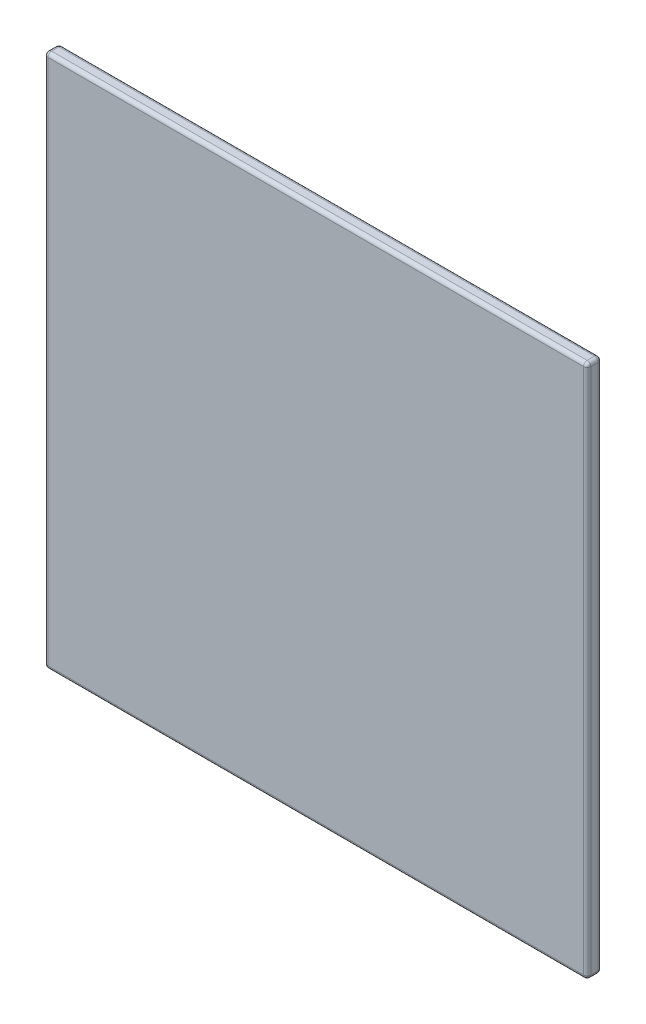
ISO-10303-21;
HEADER;
FILE_DESCRIPTION(('STEP AP214'),'2;1');
FILE_NAME('part.step','',(''),(''),'','','');
FILE_SCHEMA(('AUTOMOTIVE_DESIGN { 1 0 10303 214 1 1 1 1 }'));
ENDSEC;
DATA;
#1=APPLICATION_CONTEXT('core data for automotive mechanical design processes');
#2=APPLICATION_PROTOCOL_DEFINITION('international standard','automotive_design',2000,#1);
#3=PRODUCT_CONTEXT('',#1,'mechanical');
#4=PRODUCT('Part','Part','',(#3));
#5=PRODUCT_RELATED_PRODUCT_CATEGORY('part','',(#4));
#6=PRODUCT_DEFINITION_FORMATION('','',#4);
#7=PRODUCT_DEFINITION_CONTEXT('part definition',#1,'design');
#8=PRODUCT_DEFINITION('design','',#6,#7);
#9=PRODUCT_DEFINITION_SHAPE('','',#8);
#10=(LENGTH_UNIT() NAMED_UNIT(*) SI_UNIT(.MILLI.,.METRE.));
#11=(NAMED_UNIT(*) PLANE_ANGLE_UNIT() SI_UNIT($,.RADIAN.));
#12=(NAMED_UNIT(*) SI_UNIT($,.STERADIAN.) SOLID_ANGLE_UNIT());
#13=UNCERTAINTY_MEASURE_WITH_UNIT(LENGTH_MEASURE(1.E-05),#10,'distance_accuracy_value','');
#14=(GEOMETRIC_REPRESENTATION_CONTEXT(3) GLOBAL_UNCERTAINTY_ASSIGNED_CONTEXT((#13)) GLOBAL_UNIT_ASSIGNED_CONTEXT((#10,
#11,#12)) REPRESENTATION_CONTEXT('',''));
#15=CARTESIAN_POINT('',(0.,0.,0.));
#16=DIRECTION('',(0.,0.,1.));
#17=DIRECTION('',(1.,0.,0.));
#18=AXIS2_PLACEMENT_3D('',#15,#16,#17);
#19=CARTESIAN_POINT('',(37.35,-36.75,2.));
#20=DIRECTION('',(-1.,0.,0.));
#21=DIRECTION('',(0.,0.,1.));
#22=AXIS2_PLACEMENT_3D('',#19,#20,#21);
#23=PLANE('',#22);
#24=DIRECTION('',(0.,1.,0.));
#25=VECTOR('',#24,1.);
#26=CARTESIAN_POINT('',(37.35,-36.75,1.5));
#27=LINE('',#26,#25);
#28=CARTESIAN_POINT('',(37.35,36.25,1.5));
#29=VERTEX_POINT('',#28);
#30=CARTESIAN_POINT('',(37.35,-36.25,1.5));
#31=VERTEX_POINT('',#30);
#32=EDGE_CURVE('E42',#29,#31,#27,.F.);
#33=ORIENTED_EDGE('',*,*,#32,.T.);
#34=DIRECTION('',(0.,0.,-1.));
#35=VECTOR('',#34,1.);
#36=CARTESIAN_POINT('',(37.35,-36.25,2.));
#37=LINE('',#36,#35);
#38=CARTESIAN_POINT('',(37.35,-36.25,0.5));
#39=VERTEX_POINT('',#38);
#40=EDGE_CURVE('E11',#31,#39,#37,.T.);
#41=ORIENTED_EDGE('',*,*,#40,.T.);
#42=DIRECTION('',(0.,1.,0.));
#43=VECTOR('',#42,1.);
#44=CARTESIAN_POINT('',(37.35,36.75,0.5));
#45=LINE('',#44,#43);
#46=CARTESIAN_POINT('',(37.35,36.25,0.5));
#47=VERTEX_POINT('',#46);
#48=EDGE_CURVE('E194',#39,#47,#45,.T.);
#49=ORIENTED_EDGE('',*,*,#48,.T.);
#50=DIRECTION('',(0.,0.,-1.));
#51=VECTOR('',#50,1.);
#52=CARTESIAN_POINT('',(37.35,36.25,2.));
#53=LINE('',#52,#51);
#54=EDGE_CURVE('E53',#47,#29,#53,.F.);
#55=ORIENTED_EDGE('',*,*,#54,.T.);
#56=EDGE_LOOP('',(#33,#41,#49,#55));
#57=FACE_BOUND('',#56,.T.);
#58=ADVANCED_FACE('F33',(#57),#23,.F.);
#59=CARTESIAN_POINT('',(-37.35,36.75,2.));
#60=DIRECTION('',(0.,-1.,0.));
#61=DIRECTION('',(0.,0.,-1.));
#62=AXIS2_PLACEMENT_3D('',#59,#60,#61);
#63=PLANE('',#62);
#64=DIRECTION('',(0.,0.,-1.));
#65=VECTOR('',#64,1.);
#66=CARTESIAN_POINT('',(-36.85,36.75,2.));
#67=LINE('',#66,#65);
#68=CARTESIAN_POINT('',(-36.85,36.75,0.5));
#69=VERTEX_POINT('',#68);
#70=CARTESIAN_POINT('',(-36.85,36.75,1.5));
#71=VERTEX_POINT('',#70);
#72=EDGE_CURVE('E189',#69,#71,#67,.F.);
#73=ORIENTED_EDGE('',*,*,#72,.T.);
#74=DIRECTION('',(-1.,0.,0.));
#75=VECTOR('',#74,1.);
#76=CARTESIAN_POINT('',(-37.35,36.75,1.5));
#77=LINE('',#76,#75);
#78=CARTESIAN_POINT('',(36.85,36.75,1.5));
#79=VERTEX_POINT('',#78);
#80=EDGE_CURVE('E191',#71,#79,#77,.F.);
#81=ORIENTED_EDGE('',*,*,#80,.T.);
#82=DIRECTION('',(0.,0.,-1.));
#83=VECTOR('',#82,1.);
#84=CARTESIAN_POINT('',(36.85,36.75,2.));
#85=LINE('',#84,#83);
#86=CARTESIAN_POINT('',(36.85,36.75,0.5));
#87=VERTEX_POINT('',#86);
#88=EDGE_CURVE('E185',#79,#87,#85,.T.);
#89=ORIENTED_EDGE('',*,*,#88,.T.);
#90=DIRECTION('',(-1.,0.,0.));
#91=VECTOR('',#90,1.);
#92=CARTESIAN_POINT('',(-37.35,36.75,0.5));
#93=LINE('',#92,#91);
#94=EDGE_CURVE('E187',#87,#69,#93,.T.);
#95=ORIENTED_EDGE('',*,*,#94,.T.);
#96=EDGE_LOOP('',(#73,#81,#89,#95));
#97=FACE_BOUND('',#96,.T.);
#98=ADVANCED_FACE('F278',(#97),#63,.F.);
#99=CARTESIAN_POINT('',(-37.35,-36.75,2.));
#100=DIRECTION('',(1.,0.,0.));
#101=DIRECTION('',(0.,0.,-1.));
#102=AXIS2_PLACEMENT_3D('',#99,#100,#101);
#103=PLANE('',#102);
#104=DIRECTION('',(0.,0.,-1.));
#105=VECTOR('',#104,1.);
#106=CARTESIAN_POINT('',(-37.35,-36.25,2.));
#107=LINE('',#106,#105);
#108=CARTESIAN_POINT('',(-37.35,-36.25,0.5));
#109=VERTEX_POINT('',#108);
#110=CARTESIAN_POINT('',(-37.35,-36.25,1.5));
#111=VERTEX_POINT('',#110);
#112=EDGE_CURVE('E180',#109,#111,#107,.F.);
#113=ORIENTED_EDGE('',*,*,#112,.T.);
#114=DIRECTION('',(0.,-1.,0.));
#115=VECTOR('',#114,1.);
#116=CARTESIAN_POINT('',(-37.35,-36.75,1.5));
#117=LINE('',#116,#115);
#118=CARTESIAN_POINT('',(-37.35,36.25,1.5));
#119=VERTEX_POINT('',#118);
#120=EDGE_CURVE('E182',#111,#119,#117,.F.);
#121=ORIENTED_EDGE('',*,*,#120,.T.);
#122=DIRECTION('',(0.,0.,-1.));
#123=VECTOR('',#122,1.);
#124=CARTESIAN_POINT('',(-37.35,36.25,2.));
#125=LINE('',#124,#123);
#126=CARTESIAN_POINT('',(-37.35,36.25,0.5));
#127=VERTEX_POINT('',#126);
#128=EDGE_CURVE('E176',#119,#127,#125,.T.);
#129=ORIENTED_EDGE('',*,*,#128,.T.);
#130=DIRECTION('',(0.,-1.,0.));
#131=VECTOR('',#130,1.);
#132=CARTESIAN_POINT('',(-37.35,-36.75,0.5));
#133=LINE('',#132,#131);
#134=EDGE_CURVE('E178',#127,#109,#133,.T.);
#135=ORIENTED_EDGE('',*,*,#134,.T.);
#136=EDGE_LOOP('',(#113,#121,#129,#135));
#137=FACE_BOUND('',#136,.T.);
#138=ADVANCED_FACE('F269',(#137),#103,.F.);
#139=CARTESIAN_POINT('',(-37.35,-36.75,2.));
#140=DIRECTION('',(0.,1.,0.));
#141=DIRECTION('',(0.,0.,1.));
#142=AXIS2_PLACEMENT_3D('',#139,#140,#141);
#143=PLANE('',#142);
#144=DIRECTION('',(1.,0.,0.));
#145=VECTOR('',#144,1.);
#146=CARTESIAN_POINT('',(-37.35,-36.75,1.5));
#147=LINE('',#146,#145);
#148=CARTESIAN_POINT('',(36.85,-36.75,1.5));
#149=VERTEX_POINT('',#148);
#150=CARTESIAN_POINT('',(-36.85,-36.75,1.5));
#151=VERTEX_POINT('',#150);
#152=EDGE_CURVE('E129',#149,#151,#147,.F.);
#153=ORIENTED_EDGE('',*,*,#152,.T.);
#154=DIRECTION('',(0.,0.,-1.));
#155=VECTOR('',#154,1.);
#156=CARTESIAN_POINT('',(-36.85,-36.75,2.));
#157=LINE('',#156,#155);
#158=CARTESIAN_POINT('',(-36.85,-36.75,0.5));
#159=VERTEX_POINT('',#158);
#160=EDGE_CURVE('E165',#151,#159,#157,.T.);
#161=ORIENTED_EDGE('',*,*,#160,.T.);
#162=DIRECTION('',(1.,0.,0.));
#163=VECTOR('',#162,1.);
#164=CARTESIAN_POINT('',(37.35,-36.75,0.5));
#165=LINE('',#164,#163);
#166=CARTESIAN_POINT('',(36.85,-36.75,0.5));
#167=VERTEX_POINT('',#166);
#168=EDGE_CURVE('E158',#159,#167,#165,.T.);
#169=ORIENTED_EDGE('',*,*,#168,.T.);
#170=DIRECTION('',(0.,0.,-1.));
#171=VECTOR('',#170,1.);
#172=CARTESIAN_POINT('',(36.85,-36.75,2.));
#173=LINE('',#172,#171);
#174=EDGE_CURVE('E156',#167,#149,#173,.F.);
#175=ORIENTED_EDGE('',*,*,#174,.T.);
#176=EDGE_LOOP('',(#153,#161,#169,#175));
#177=FACE_BOUND('',#176,.T.);
#178=ADVANCED_FACE('F356',(#177),#143,.F.);
#179=CARTESIAN_POINT('',(0.,0.,2.));
#180=DIRECTION('',(0.,0.,-1.));
#181=DIRECTION('',(-1.,0.,0.));
#182=AXIS2_PLACEMENT_3D('',#179,#180,#181);
#183=PLANE('',#182);
#184=DIRECTION('',(0.,-1.,0.));
#185=VECTOR('',#184,1.);
#186=CARTESIAN_POINT('',(-36.85,0.,2.));
#187=LINE('',#186,#185);
#188=CARTESIAN_POINT('',(-36.85,36.25,2.));
#189=VERTEX_POINT('',#188);
#190=CARTESIAN_POINT('',(-36.85,-36.25,2.));
#191=VERTEX_POINT('',#190);
#192=EDGE_CURVE('E154',#189,#191,#187,.T.);
#193=ORIENTED_EDGE('',*,*,#192,.T.);
#194=DIRECTION('',(1.,0.,0.));
#195=VECTOR('',#194,1.);
#196=CARTESIAN_POINT('',(0.,-36.25,2.));
#197=LINE('',#196,#195);
#198=CARTESIAN_POINT('',(36.85,-36.25,2.));
#199=VERTEX_POINT('',#198);
#200=EDGE_CURVE('E127',#191,#199,#197,.T.);
#201=ORIENTED_EDGE('',*,*,#200,.T.);
#202=DIRECTION('',(0.,1.,0.));
#203=VECTOR('',#202,1.);
#204=CARTESIAN_POINT('',(36.85,0.,2.));
#205=LINE('',#204,#203);
#206=CARTESIAN_POINT('',(36.85,36.25,2.));
#207=VERTEX_POINT('',#206);
#208=EDGE_CURVE('E144',#199,#207,#205,.T.);
#209=ORIENTED_EDGE('',*,*,#208,.T.);
#210=DIRECTION('',(-1.,0.,0.));
#211=VECTOR('',#210,1.);
#212=CARTESIAN_POINT('',(0.,36.25,2.));
#213=LINE('',#212,#211);
#214=EDGE_CURVE('E150',#207,#189,#213,.T.);
#215=ORIENTED_EDGE('',*,*,#214,.T.);
#216=EDGE_LOOP('',(#193,#201,#209,#215));
#217=FACE_BOUND('',#216,.T.);
#218=ADVANCED_FACE('F152',(#217),#183,.F.);
#219=CARTESIAN_POINT('',(0.,0.,0.));
#220=DIRECTION('',(0.,0.,-1.));
#221=DIRECTION('',(-1.,0.,0.));
#222=AXIS2_PLACEMENT_3D('',#219,#220,#221);
#223=PLANE('',#222);
#224=DIRECTION('',(0.,1.,0.));
#225=VECTOR('',#224,1.);
#226=CARTESIAN_POINT('',(36.85,-36.75,0.));
#227=LINE('',#226,#225);
#228=CARTESIAN_POINT('',(36.85,36.25,0.));
#229=VERTEX_POINT('',#228);
#230=CARTESIAN_POINT('',(36.85,-36.25,0.));
#231=VERTEX_POINT('',#230);
#232=EDGE_CURVE('E167',#229,#231,#227,.F.);
#233=ORIENTED_EDGE('',*,*,#232,.T.);
#234=DIRECTION('',(1.,0.,0.));
#235=VECTOR('',#234,1.);
#236=CARTESIAN_POINT('',(-37.35,-36.25,0.));
#237=LINE('',#236,#235);
#238=CARTESIAN_POINT('',(-36.85,-36.25,0.));
#239=VERTEX_POINT('',#238);
#240=EDGE_CURVE('E173',#231,#239,#237,.F.);
#241=ORIENTED_EDGE('',*,*,#240,.T.);
#242=DIRECTION('',(0.,-1.,0.));
#243=VECTOR('',#242,1.);
#244=CARTESIAN_POINT('',(-36.85,36.75,0.));
#245=LINE('',#244,#243);
#246=CARTESIAN_POINT('',(-36.85,36.25,0.));
#247=VERTEX_POINT('',#246);
#248=EDGE_CURVE('E171',#239,#247,#245,.F.);
#249=ORIENTED_EDGE('',*,*,#248,.T.);
#250=DIRECTION('',(-1.,0.,0.));
#251=VECTOR('',#250,1.);
#252=CARTESIAN_POINT('',(37.35,36.25,0.));
#253=LINE('',#252,#251);
#254=EDGE_CURVE('E169',#247,#229,#253,.F.);
#255=ORIENTED_EDGE('',*,*,#254,.T.);
#256=EDGE_LOOP('',(#233,#241,#249,#255));
#257=FACE_BOUND('',#256,.T.);
#258=ADVANCED_FACE('F296',(#257),#223,.T.);
#259=CARTESIAN_POINT('',(-37.35,36.25,0.5));
#260=DIRECTION('',(1.,0.,0.));
#261=DIRECTION('',(0.,0.,-1.));
#262=AXIS2_PLACEMENT_3D('',#259,#260,#261);
#263=CYLINDRICAL_SURFACE('',#262,0.5);
#264=CARTESIAN_POINT('',(-36.85,36.25,0.5));
#265=DIRECTION('',(-1.,0.,0.));
#266=DIRECTION('',(0.,0.,1.));
#267=AXIS2_PLACEMENT_3D('',#264,#265,#266);
#268=CIRCLE('',#267,0.5);
#269=EDGE_CURVE('E37',#69,#247,#268,.T.);
#270=ORIENTED_EDGE('',*,*,#269,.F.);
#271=ORIENTED_EDGE('',*,*,#94,.F.);
#272=CARTESIAN_POINT('',(36.85,36.25,0.5));
#273=DIRECTION('',(1.,0.,0.));
#274=DIRECTION('',(0.,0.,-1.));
#275=AXIS2_PLACEMENT_3D('',#272,#273,#274);
#276=CIRCLE('',#275,0.5);
#277=EDGE_CURVE('E246',#229,#87,#276,.T.);
#278=ORIENTED_EDGE('',*,*,#277,.F.);
#279=ORIENTED_EDGE('',*,*,#254,.F.);
#280=EDGE_LOOP('',(#270,#271,#278,#279));
#281=FACE_BOUND('',#280,.T.);
#282=ADVANCED_FACE('F35',(#281),#263,.T.);
#283=CARTESIAN_POINT('',(-36.85,36.25,0.5));
#284=DIRECTION('',(0.,0.,1.));
#285=DIRECTION('',(1.,0.,0.));
#286=AXIS2_PLACEMENT_3D('',#283,#284,#285);
#287=SPHERICAL_SURFACE('',#286,0.5);
#288=CARTESIAN_POINT('',(-36.85,36.25,0.5));
#289=DIRECTION('',(0.,0.,-1.));
#290=DIRECTION('',(-1.,0.,0.));
#291=AXIS2_PLACEMENT_3D('',#288,#289,#290);
#292=CIRCLE('',#291,0.5);
#293=EDGE_CURVE('E241',#69,#127,#292,.F.);
#294=ORIENTED_EDGE('',*,*,#293,.F.);
#295=ORIENTED_EDGE('',*,*,#269,.T.);
#296=CARTESIAN_POINT('',(-36.85,36.25,0.5));
#297=DIRECTION('',(0.,1.,0.));
#298=DIRECTION('',(0.,0.,1.));
#299=AXIS2_PLACEMENT_3D('',#296,#297,#298);
#300=CIRCLE('',#299,0.5);
#301=EDGE_CURVE('E244',#127,#247,#300,.F.);
#302=ORIENTED_EDGE('',*,*,#301,.F.);
#303=EDGE_LOOP('',(#294,#295,#302));
#304=FACE_BOUND('',#303,.T.);
#305=ADVANCED_FACE('F257',(#304),#287,.T.);
#306=CARTESIAN_POINT('',(36.85,36.25,0.5));
#307=DIRECTION('',(0.,0.,1.));
#308=DIRECTION('',(1.,0.,0.));
#309=AXIS2_PLACEMENT_3D('',#306,#307,#308);
#310=SPHERICAL_SURFACE('',#309,0.5);
#311=CARTESIAN_POINT('',(36.85,36.25,0.5));
#312=DIRECTION('',(0.,1.,0.));
#313=DIRECTION('',(0.,0.,1.));
#314=AXIS2_PLACEMENT_3D('',#311,#312,#313);
#315=CIRCLE('',#314,0.5);
#316=EDGE_CURVE('E235',#229,#47,#315,.F.);
#317=ORIENTED_EDGE('',*,*,#316,.F.);
#318=ORIENTED_EDGE('',*,*,#277,.T.);
#319=CARTESIAN_POINT('',(36.85,36.25,0.5));
#320=DIRECTION('',(0.,0.,-1.));
#321=DIRECTION('',(-1.,0.,0.));
#322=AXIS2_PLACEMENT_3D('',#319,#320,#321);
#323=CIRCLE('',#322,0.5);
#324=EDGE_CURVE('E238',#47,#87,#323,.F.);
#325=ORIENTED_EDGE('',*,*,#324,.F.);
#326=EDGE_LOOP('',(#317,#318,#325));
#327=FACE_BOUND('',#326,.T.);
#328=ADVANCED_FACE('F289',(#327),#310,.T.);
#329=CARTESIAN_POINT('',(-36.85,-36.75,0.5));
#330=DIRECTION('',(0.,1.,0.));
#331=DIRECTION('',(0.,0.,1.));
#332=AXIS2_PLACEMENT_3D('',#329,#330,#331);
#333=CYLINDRICAL_SURFACE('',#332,0.5);
#334=ORIENTED_EDGE('',*,*,#301,.T.);
#335=ORIENTED_EDGE('',*,*,#248,.F.);
#336=CARTESIAN_POINT('',(-36.85,-36.25,0.5));
#337=DIRECTION('',(0.,-1.,0.));
#338=DIRECTION('',(0.,0.,-1.));
#339=AXIS2_PLACEMENT_3D('',#336,#337,#338);
#340=CIRCLE('',#339,0.5);
#341=EDGE_CURVE('E230',#109,#239,#340,.T.);
#342=ORIENTED_EDGE('',*,*,#341,.F.);
#343=ORIENTED_EDGE('',*,*,#134,.F.);
#344=EDGE_LOOP('',(#334,#335,#342,#343));
#345=FACE_BOUND('',#344,.T.);
#346=ADVANCED_FACE('F265',(#345),#333,.T.);
#347=CARTESIAN_POINT('',(-36.85,36.25,2.));
#348=DIRECTION('',(0.,0.,-1.));
#349=DIRECTION('',(-1.,0.,0.));
#350=AXIS2_PLACEMENT_3D('',#347,#348,#349);
#351=CYLINDRICAL_SURFACE('',#350,0.5);
#352=ORIENTED_EDGE('',*,*,#293,.T.);
#353=ORIENTED_EDGE('',*,*,#128,.F.);
#354=CARTESIAN_POINT('',(-36.85,36.25,1.5));
#355=DIRECTION('',(0.,0.,1.));
#356=DIRECTION('',(1.,0.,0.));
#357=AXIS2_PLACEMENT_3D('',#354,#355,#356);
#358=CIRCLE('',#357,0.5);
#359=EDGE_CURVE('E227',#71,#119,#358,.T.);
#360=ORIENTED_EDGE('',*,*,#359,.F.);
#361=ORIENTED_EDGE('',*,*,#72,.F.);
#362=EDGE_LOOP('',(#352,#353,#360,#361));
#363=FACE_BOUND('',#362,.T.);
#364=ADVANCED_FACE('F275',(#363),#351,.T.);
#365=CARTESIAN_POINT('',(0.,36.25,1.5));
#366=DIRECTION('',(-1.,0.,0.));
#367=DIRECTION('',(0.,0.,1.));
#368=AXIS2_PLACEMENT_3D('',#365,#366,#367);
#369=CYLINDRICAL_SURFACE('',#368,0.5);
#370=CARTESIAN_POINT('',(36.85,36.25,1.5));
#371=DIRECTION('',(1.,0.,0.));
#372=DIRECTION('',(0.,0.,-1.));
#373=AXIS2_PLACEMENT_3D('',#370,#371,#372);
#374=CIRCLE('',#373,0.5);
#375=EDGE_CURVE('E221',#79,#207,#374,.T.);
#376=ORIENTED_EDGE('',*,*,#375,.F.);
#377=ORIENTED_EDGE('',*,*,#80,.F.);
#378=CARTESIAN_POINT('',(-36.85,36.25,1.5));
#379=DIRECTION('',(-1.,0.,0.));
#380=DIRECTION('',(0.,0.,1.));
#381=AXIS2_PLACEMENT_3D('',#378,#379,#380);
#382=CIRCLE('',#381,0.5);
#383=EDGE_CURVE('E224',#189,#71,#382,.T.);
#384=ORIENTED_EDGE('',*,*,#383,.F.);
#385=ORIENTED_EDGE('',*,*,#214,.F.);
#386=EDGE_LOOP('',(#376,#377,#384,#385));
#387=FACE_BOUND('',#386,.T.);
#388=ADVANCED_FACE('F282',(#387),#369,.T.);
#389=CARTESIAN_POINT('',(36.85,36.25,2.));
#390=DIRECTION('',(0.,0.,-1.));
#391=DIRECTION('',(-1.,0.,0.));
#392=AXIS2_PLACEMENT_3D('',#389,#390,#391);
#393=CYLINDRICAL_SURFACE('',#392,0.5);
#394=ORIENTED_EDGE('',*,*,#324,.T.);
#395=ORIENTED_EDGE('',*,*,#88,.F.);
#396=CARTESIAN_POINT('',(36.85,36.25,1.5));
#397=DIRECTION('',(0.,0.,1.));
#398=DIRECTION('',(1.,0.,0.));
#399=AXIS2_PLACEMENT_3D('',#396,#397,#398);
#400=CIRCLE('',#399,0.5);
#401=EDGE_CURVE('E219',#29,#79,#400,.T.);
#402=ORIENTED_EDGE('',*,*,#401,.F.);
#403=ORIENTED_EDGE('',*,*,#54,.F.);
#404=EDGE_LOOP('',(#394,#395,#402,#403));
#405=FACE_BOUND('',#404,.T.);
#406=ADVANCED_FACE('F287',(#405),#393,.T.);
#407=CARTESIAN_POINT('',(36.85,-36.75,0.5));
#408=DIRECTION('',(0.,-1.,0.));
#409=DIRECTION('',(0.,0.,-1.));
#410=AXIS2_PLACEMENT_3D('',#407,#408,#409);
#411=CYLINDRICAL_SURFACE('',#410,0.5);
#412=ORIENTED_EDGE('',*,*,#316,.T.);
#413=ORIENTED_EDGE('',*,*,#48,.F.);
#414=CARTESIAN_POINT('',(36.85,-36.25,0.5));
#415=DIRECTION('',(0.,-1.,0.));
#416=DIRECTION('',(0.,0.,-1.));
#417=AXIS2_PLACEMENT_3D('',#414,#415,#416);
#418=CIRCLE('',#417,0.5);
#419=EDGE_CURVE('E216',#231,#39,#418,.T.);
#420=ORIENTED_EDGE('',*,*,#419,.F.);
#421=ORIENTED_EDGE('',*,*,#232,.F.);
#422=EDGE_LOOP('',(#412,#413,#420,#421));
#423=FACE_BOUND('',#422,.T.);
#424=ADVANCED_FACE('F293',(#423),#411,.T.);
#425=CARTESIAN_POINT('',(-37.35,-36.25,0.5));
#426=DIRECTION('',(-1.,0.,0.));
#427=DIRECTION('',(0.,0.,1.));
#428=AXIS2_PLACEMENT_3D('',#425,#426,#427);
#429=CYLINDRICAL_SURFACE('',#428,0.5);
#430=CARTESIAN_POINT('',(-36.85,-36.25,0.5));
#431=DIRECTION('',(-1.,0.,0.));
#432=DIRECTION('',(0.,0.,1.));
#433=AXIS2_PLACEMENT_3D('',#430,#431,#432);
#434=CIRCLE('',#433,0.5);
#435=EDGE_CURVE('E232',#239,#159,#434,.T.);
#436=ORIENTED_EDGE('',*,*,#435,.F.);
#437=ORIENTED_EDGE('',*,*,#240,.F.);
#438=CARTESIAN_POINT('',(36.85,-36.25,0.5));
#439=DIRECTION('',(1.,0.,0.));
#440=DIRECTION('',(0.,0.,-1.));
#441=AXIS2_PLACEMENT_3D('',#438,#439,#440);
#442=CIRCLE('',#441,0.5);
#443=EDGE_CURVE('E213',#167,#231,#442,.T.);
#444=ORIENTED_EDGE('',*,*,#443,.F.);
#445=ORIENTED_EDGE('',*,*,#168,.F.);
#446=EDGE_LOOP('',(#436,#437,#444,#445));
#447=FACE_BOUND('',#446,.T.);
#448=ADVANCED_FACE('F300',(#447),#429,.T.);
#449=CARTESIAN_POINT('',(-36.85,-36.25,0.5));
#450=DIRECTION('',(0.,0.,1.));
#451=DIRECTION('',(1.,0.,0.));
#452=AXIS2_PLACEMENT_3D('',#449,#450,#451);
#453=SPHERICAL_SURFACE('',#452,0.5);
#454=ORIENTED_EDGE('',*,*,#341,.T.);
#455=ORIENTED_EDGE('',*,*,#435,.T.);
#456=CARTESIAN_POINT('',(-36.85,-36.25,0.5));
#457=DIRECTION('',(0.,0.,-1.));
#458=DIRECTION('',(-1.,0.,0.));
#459=AXIS2_PLACEMENT_3D('',#456,#457,#458);
#460=CIRCLE('',#459,0.5);
#461=EDGE_CURVE('E210',#109,#159,#460,.F.);
#462=ORIENTED_EDGE('',*,*,#461,.F.);
#463=EDGE_LOOP('',(#454,#455,#462));
#464=FACE_BOUND('',#463,.T.);
#465=ADVANCED_FACE('F304',(#464),#453,.T.);
#466=CARTESIAN_POINT('',(-36.85,36.25,1.5));
#467=DIRECTION('',(0.,0.,1.));
#468=DIRECTION('',(1.,0.,0.));
#469=AXIS2_PLACEMENT_3D('',#466,#467,#468);
#470=SPHERICAL_SURFACE('',#469,0.5);
#471=ORIENTED_EDGE('',*,*,#383,.T.);
#472=ORIENTED_EDGE('',*,*,#359,.T.);
#473=CARTESIAN_POINT('',(-36.85,36.25,1.5));
#474=DIRECTION('',(0.,1.,0.));
#475=DIRECTION('',(0.,0.,1.));
#476=AXIS2_PLACEMENT_3D('',#473,#474,#475);
#477=CIRCLE('',#476,0.5);
#478=EDGE_CURVE('E208',#189,#119,#477,.F.);
#479=ORIENTED_EDGE('',*,*,#478,.F.);
#480=EDGE_LOOP('',(#471,#472,#479));
#481=FACE_BOUND('',#480,.T.);
#482=ADVANCED_FACE('F315',(#481),#470,.T.);
#483=CARTESIAN_POINT('',(36.85,36.25,1.5));
#484=DIRECTION('',(0.,0.,1.));
#485=DIRECTION('',(1.,0.,0.));
#486=AXIS2_PLACEMENT_3D('',#483,#484,#485);
#487=SPHERICAL_SURFACE('',#486,0.5);
#488=ORIENTED_EDGE('',*,*,#401,.T.);
#489=ORIENTED_EDGE('',*,*,#375,.T.);
#490=CARTESIAN_POINT('',(36.85,36.25,1.5));
#491=DIRECTION('',(0.,1.,0.));
#492=DIRECTION('',(0.,0.,1.));
#493=AXIS2_PLACEMENT_3D('',#490,#491,#492);
#494=CIRCLE('',#493,0.5);
#495=EDGE_CURVE('E147',#29,#207,#494,.F.);
#496=ORIENTED_EDGE('',*,*,#495,.F.);
#497=EDGE_LOOP('',(#488,#489,#496));
#498=FACE_BOUND('',#497,.T.);
#499=ADVANCED_FACE('F317',(#498),#487,.T.);
#500=CARTESIAN_POINT('',(36.85,-36.25,0.5));
#501=DIRECTION('',(0.,0.,1.));
#502=DIRECTION('',(1.,0.,0.));
#503=AXIS2_PLACEMENT_3D('',#500,#501,#502);
#504=SPHERICAL_SURFACE('',#503,0.5);
#505=ORIENTED_EDGE('',*,*,#443,.T.);
#506=ORIENTED_EDGE('',*,*,#419,.T.);
#507=CARTESIAN_POINT('',(36.85,-36.25,0.5));
#508=DIRECTION('',(0.,0.,-1.));
#509=DIRECTION('',(-1.,0.,0.));
#510=AXIS2_PLACEMENT_3D('',#507,#508,#509);
#511=CIRCLE('',#510,0.5);
#512=EDGE_CURVE('E205',#167,#39,#511,.F.);
#513=ORIENTED_EDGE('',*,*,#512,.F.);
#514=EDGE_LOOP('',(#505,#506,#513));
#515=FACE_BOUND('',#514,.T.);
#516=ADVANCED_FACE('F323',(#515),#504,.T.);
#517=CARTESIAN_POINT('',(-36.85,-36.25,2.));
#518=DIRECTION('',(0.,0.,-1.));
#519=DIRECTION('',(-1.,0.,0.));
#520=AXIS2_PLACEMENT_3D('',#517,#518,#519);
#521=CYLINDRICAL_SURFACE('',#520,0.5);
#522=ORIENTED_EDGE('',*,*,#461,.T.);
#523=ORIENTED_EDGE('',*,*,#160,.F.);
#524=CARTESIAN_POINT('',(-36.85,-36.25,1.5));
#525=DIRECTION('',(0.,0.,1.));
#526=DIRECTION('',(1.,0.,0.));
#527=AXIS2_PLACEMENT_3D('',#524,#525,#526);
#528=CIRCLE('',#527,0.5);
#529=EDGE_CURVE('E202',#111,#151,#528,.T.);
#530=ORIENTED_EDGE('',*,*,#529,.F.);
#531=ORIENTED_EDGE('',*,*,#112,.F.);
#532=EDGE_LOOP('',(#522,#523,#530,#531));
#533=FACE_BOUND('',#532,.T.);
#534=ADVANCED_FACE('F307',(#533),#521,.T.);
#535=CARTESIAN_POINT('',(-36.85,0.,1.5));
#536=DIRECTION('',(0.,-1.,0.));
#537=DIRECTION('',(0.,0.,-1.));
#538=AXIS2_PLACEMENT_3D('',#535,#536,#537);
#539=CYLINDRICAL_SURFACE('',#538,0.5);
#540=ORIENTED_EDGE('',*,*,#478,.T.);
#541=ORIENTED_EDGE('',*,*,#120,.F.);
#542=CARTESIAN_POINT('',(-36.85,-36.25,1.5));
#543=DIRECTION('',(0.,-1.,0.));
#544=DIRECTION('',(0.,0.,-1.));
#545=AXIS2_PLACEMENT_3D('',#542,#543,#544);
#546=CIRCLE('',#545,0.5);
#547=EDGE_CURVE('E141',#191,#111,#546,.T.);
#548=ORIENTED_EDGE('',*,*,#547,.F.);
#549=ORIENTED_EDGE('',*,*,#192,.F.);
#550=EDGE_LOOP('',(#540,#541,#548,#549));
#551=FACE_BOUND('',#550,.T.);
#552=ADVANCED_FACE('F313',(#551),#539,.T.);
#553=CARTESIAN_POINT('',(36.85,0.,1.5));
#554=DIRECTION('',(0.,1.,0.));
#555=DIRECTION('',(0.,0.,1.));
#556=AXIS2_PLACEMENT_3D('',#553,#554,#555);
#557=CYLINDRICAL_SURFACE('',#556,0.5);
#558=ORIENTED_EDGE('',*,*,#495,.T.);
#559=ORIENTED_EDGE('',*,*,#208,.F.);
#560=CARTESIAN_POINT('',(36.85,-36.25,1.5));
#561=DIRECTION('',(0.,-1.,0.));
#562=DIRECTION('',(0.,0.,-1.));
#563=AXIS2_PLACEMENT_3D('',#560,#561,#562);
#564=CIRCLE('',#563,0.5);
#565=EDGE_CURVE('E135',#31,#199,#564,.T.);
#566=ORIENTED_EDGE('',*,*,#565,.F.);
#567=ORIENTED_EDGE('',*,*,#32,.F.);
#568=EDGE_LOOP('',(#558,#559,#566,#567));
#569=FACE_BOUND('',#568,.T.);
#570=ADVANCED_FACE('F145',(#569),#557,.T.);
#571=CARTESIAN_POINT('',(36.85,-36.25,2.));
#572=DIRECTION('',(0.,0.,-1.));
#573=DIRECTION('',(-1.,0.,0.));
#574=AXIS2_PLACEMENT_3D('',#571,#572,#573);
#575=CYLINDRICAL_SURFACE('',#574,0.5);
#576=ORIENTED_EDGE('',*,*,#512,.T.);
#577=ORIENTED_EDGE('',*,*,#40,.F.);
#578=CARTESIAN_POINT('',(36.85,-36.25,1.5));
#579=DIRECTION('',(0.,0.,1.));
#580=DIRECTION('',(1.,0.,0.));
#581=AXIS2_PLACEMENT_3D('',#578,#579,#580);
#582=CIRCLE('',#581,0.5);
#583=EDGE_CURVE('E139',#149,#31,#582,.T.);
#584=ORIENTED_EDGE('',*,*,#583,.F.);
#585=ORIENTED_EDGE('',*,*,#174,.F.);
#586=EDGE_LOOP('',(#576,#577,#584,#585));
#587=FACE_BOUND('',#586,.T.);
#588=ADVANCED_FACE('F340',(#587),#575,.T.);
#589=CARTESIAN_POINT('',(-36.85,-36.25,1.5));
#590=DIRECTION('',(0.,0.,1.));
#591=DIRECTION('',(1.,0.,0.));
#592=AXIS2_PLACEMENT_3D('',#589,#590,#591);
#593=SPHERICAL_SURFACE('',#592,0.5);
#594=ORIENTED_EDGE('',*,*,#547,.T.);
#595=ORIENTED_EDGE('',*,*,#529,.T.);
#596=CARTESIAN_POINT('',(-36.85,-36.25,1.5));
#597=DIRECTION('',(-1.,0.,0.));
#598=DIRECTION('',(0.,0.,1.));
#599=AXIS2_PLACEMENT_3D('',#596,#597,#598);
#600=CIRCLE('',#599,0.5);
#601=EDGE_CURVE('E132',#191,#151,#600,.F.);
#602=ORIENTED_EDGE('',*,*,#601,.F.);
#603=EDGE_LOOP('',(#594,#595,#602));
#604=FACE_BOUND('',#603,.T.);
#605=ADVANCED_FACE('F311',(#604),#593,.T.);
#606=CARTESIAN_POINT('',(36.85,-36.25,1.5));
#607=DIRECTION('',(0.,0.,1.));
#608=DIRECTION('',(1.,0.,0.));
#609=AXIS2_PLACEMENT_3D('',#606,#607,#608);
#610=SPHERICAL_SURFACE('',#609,0.5);
#611=ORIENTED_EDGE('',*,*,#583,.T.);
#612=ORIENTED_EDGE('',*,*,#565,.T.);
#613=CARTESIAN_POINT('',(36.85,-36.25,1.5));
#614=DIRECTION('',(1.,0.,0.));
#615=DIRECTION('',(0.,0.,-1.));
#616=AXIS2_PLACEMENT_3D('',#613,#614,#615);
#617=CIRCLE('',#616,0.5);
#618=EDGE_CURVE('E123',#149,#199,#617,.F.);
#619=ORIENTED_EDGE('',*,*,#618,.F.);
#620=EDGE_LOOP('',(#611,#612,#619));
#621=FACE_BOUND('',#620,.T.);
#622=ADVANCED_FACE('F137',(#621),#610,.T.);
#623=CARTESIAN_POINT('',(0.,-36.25,1.5));
#624=DIRECTION('',(1.,0.,0.));
#625=DIRECTION('',(0.,0.,-1.));
#626=AXIS2_PLACEMENT_3D('',#623,#624,#625);
#627=CYLINDRICAL_SURFACE('',#626,0.5);
#628=ORIENTED_EDGE('',*,*,#601,.T.);
#629=ORIENTED_EDGE('',*,*,#152,.F.);
#630=ORIENTED_EDGE('',*,*,#618,.T.);
#631=ORIENTED_EDGE('',*,*,#200,.F.);
#632=EDGE_LOOP('',(#628,#629,#630,#631));
#633=FACE_BOUND('',#632,.T.);
#634=ADVANCED_FACE('F125',(#633),#627,.T.);
#635=CLOSED_SHELL('',(#58,#98,#138,#178,#218,#258,#282,#305,#328,#346,#364,#388,#406,#424,#448,
#465,#482,#499,#516,#534,#552,#570,#588,#605,#622,#634));
#636=MANIFOLD_SOLID_BREP('B2',#635);
#637=ADVANCED_BREP_SHAPE_REPRESENTATION('',(#18,#636),#14);
#638=SHAPE_DEFINITION_REPRESENTATION(#9,#637);
ENDSEC;
END-ISO-10303-21;
